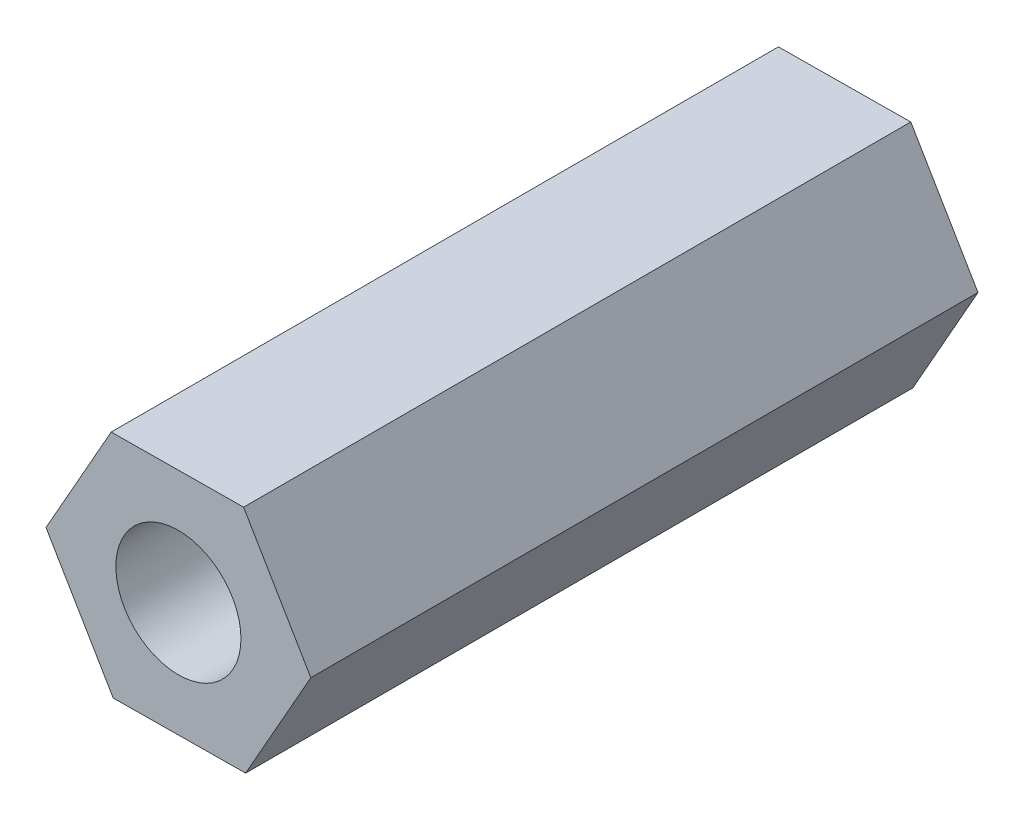
ISO-10303-21;
HEADER;
FILE_DESCRIPTION(('STEP AP214'),'2;1');
FILE_NAME('part.step','',(''),(''),'','','');
FILE_SCHEMA(('AUTOMOTIVE_DESIGN { 1 0 10303 214 1 1 1 1 }'));
ENDSEC;
DATA;
#1=APPLICATION_CONTEXT('core data for automotive mechanical design processes');
#2=APPLICATION_PROTOCOL_DEFINITION('international standard','automotive_design',2000,#1);
#3=PRODUCT_CONTEXT('',#1,'mechanical');
#4=PRODUCT('Part','Part','',(#3));
#5=PRODUCT_RELATED_PRODUCT_CATEGORY('part','',(#4));
#6=PRODUCT_DEFINITION_FORMATION('','',#4);
#7=PRODUCT_DEFINITION_CONTEXT('part definition',#1,'design');
#8=PRODUCT_DEFINITION('design','',#6,#7);
#9=PRODUCT_DEFINITION_SHAPE('','',#8);
#10=(LENGTH_UNIT() NAMED_UNIT(*) SI_UNIT(.MILLI.,.METRE.));
#11=(NAMED_UNIT(*) PLANE_ANGLE_UNIT() SI_UNIT($,.RADIAN.));
#12=(NAMED_UNIT(*) SI_UNIT($,.STERADIAN.) SOLID_ANGLE_UNIT());
#13=UNCERTAINTY_MEASURE_WITH_UNIT(LENGTH_MEASURE(1.E-05),#10,'distance_accuracy_value','');
#14=(GEOMETRIC_REPRESENTATION_CONTEXT(3) GLOBAL_UNCERTAINTY_ASSIGNED_CONTEXT((#13)) GLOBAL_UNIT_ASSIGNED_CONTEXT((#10,
#11,#12)) REPRESENTATION_CONTEXT('',''));
#15=CARTESIAN_POINT('',(0.,0.,0.));
#16=DIRECTION('',(0.,0.,1.));
#17=DIRECTION('',(1.,0.,0.));
#18=AXIS2_PLACEMENT_3D('',#15,#16,#17);
#19=CARTESIAN_POINT('',(0.,0.,16.));
#20=DIRECTION('',(0.,0.,1.));
#21=DIRECTION('',(1.,0.,0.));
#22=AXIS2_PLACEMENT_3D('',#19,#20,#21);
#23=PLANE('',#22);
#24=DIRECTION('',(0.999961257640527,0.00880245522430783,0.));
#25=VECTOR('',#24,1.);
#26=CARTESIAN_POINT('',(-1.56344497664753,-2.76386923321798,16.));
#27=LINE('',#26,#25);
#28=CARTESIAN_POINT('',(-1.56344497664753,-2.76386923321798,16.));
#29=VERTEX_POINT('',#28);
#30=CARTESIAN_POINT('',(1.61185848038122,-2.73591768380492,16.));
#31=VERTEX_POINT('',#30);
#32=EDGE_CURVE('E132',#29,#31,#27,.T.);
#33=ORIENTED_EDGE('',*,*,#32,.T.);
#34=DIRECTION('',(0.492357478980338,0.870393079529086,0.));
#35=VECTOR('',#34,1.);
#36=CARTESIAN_POINT('',(1.61185848038122,-2.73591768380492,16.));
#37=LINE('',#36,#35);
#38=CARTESIAN_POINT('',(3.17530345702875,0.0279515494130611,16.));
#39=VERTEX_POINT('',#38);
#40=EDGE_CURVE('E90',#31,#39,#37,.T.);
#41=ORIENTED_EDGE('',*,*,#40,.T.);
#42=DIRECTION('',(-0.507603778660189,0.861590624304778,0.));
#43=VECTOR('',#42,1.);
#44=CARTESIAN_POINT('',(3.17530345702875,0.0279515494130611,16.));
#45=LINE('',#44,#43);
#46=CARTESIAN_POINT('',(1.56344497664753,2.76386923321798,16.));
#47=VERTEX_POINT('',#46);
#48=EDGE_CURVE('E103',#39,#47,#45,.T.);
#49=ORIENTED_EDGE('',*,*,#48,.T.);
#50=DIRECTION('',(-0.999961257640527,-0.00880245522430783,0.));
#51=VECTOR('',#50,1.);
#52=CARTESIAN_POINT('',(1.56344497664753,2.76386923321798,16.));
#53=LINE('',#52,#51);
#54=CARTESIAN_POINT('',(-1.61185848038122,2.73591768380492,16.));
#55=VERTEX_POINT('',#54);
#56=EDGE_CURVE('E97',#47,#55,#53,.T.);
#57=ORIENTED_EDGE('',*,*,#56,.T.);
#58=DIRECTION('',(-0.492357478980338,-0.870393079529086,0.));
#59=VECTOR('',#58,1.);
#60=CARTESIAN_POINT('',(-1.61185848038122,2.73591768380492,16.));
#61=LINE('',#60,#59);
#62=CARTESIAN_POINT('',(-3.17530345702875,-0.02795154941306,16.));
#63=VERTEX_POINT('',#62);
#64=EDGE_CURVE('E101',#55,#63,#61,.T.);
#65=ORIENTED_EDGE('',*,*,#64,.T.);
#66=DIRECTION('',(0.507603778660189,-0.861590624304779,0.));
#67=VECTOR('',#66,1.);
#68=CARTESIAN_POINT('',(-3.17530345702875,-0.02795154941306,16.));
#69=LINE('',#68,#67);
#70=EDGE_CURVE('E53',#63,#29,#69,.T.);
#71=ORIENTED_EDGE('',*,*,#70,.T.);
#72=EDGE_LOOP('',(#33,#41,#49,#57,#65,#71));
#73=FACE_BOUND('',#72,.T.);
#74=CARTESIAN_POINT('',(0.,0.,16.));
#75=DIRECTION('',(0.,0.,1.));
#76=DIRECTION('',(1.,0.,0.));
#77=AXIS2_PLACEMENT_3D('',#74,#75,#76);
#78=CIRCLE('',#77,1.5);
#79=CARTESIAN_POINT('',(1.5,0.,16.));
#80=VERTEX_POINT('',#79);
#81=EDGE_CURVE('E125',#80,#80,#78,.T.);
#82=ORIENTED_EDGE('',*,*,#81,.F.);
#83=EDGE_LOOP('',(#82));
#84=FACE_BOUND('',#83,.T.);
#85=ADVANCED_FACE('F36',(#73,#84),#23,.T.);
#86=CARTESIAN_POINT('',(0.,0.,0.));
#87=DIRECTION('',(0.,0.,1.));
#88=DIRECTION('',(1.,0.,0.));
#89=AXIS2_PLACEMENT_3D('',#86,#87,#88);
#90=PLANE('',#89);
#91=DIRECTION('',(0.999961257640527,0.00880245522430783,0.));
#92=VECTOR('',#91,1.);
#93=CARTESIAN_POINT('',(-1.56344497664753,-2.76386923321798,0.));
#94=LINE('',#93,#92);
#95=CARTESIAN_POINT('',(-1.56344497664753,-2.76386923321798,0.));
#96=VERTEX_POINT('',#95);
#97=CARTESIAN_POINT('',(1.61185848038122,-2.73591768380492,0.));
#98=VERTEX_POINT('',#97);
#99=EDGE_CURVE('E121',#96,#98,#94,.T.);
#100=ORIENTED_EDGE('',*,*,#99,.F.);
#101=DIRECTION('',(0.507603778660189,-0.861590624304779,0.));
#102=VECTOR('',#101,1.);
#103=CARTESIAN_POINT('',(-3.17530345702875,-0.02795154941306,0.));
#104=LINE('',#103,#102);
#105=CARTESIAN_POINT('',(-3.17530345702875,-0.02795154941306,0.));
#106=VERTEX_POINT('',#105);
#107=EDGE_CURVE('E82',#106,#96,#104,.T.);
#108=ORIENTED_EDGE('',*,*,#107,.F.);
#109=DIRECTION('',(-0.492357478980338,-0.870393079529086,0.));
#110=VECTOR('',#109,1.);
#111=CARTESIAN_POINT('',(-1.61185848038122,2.73591768380492,0.));
#112=LINE('',#111,#110);
#113=CARTESIAN_POINT('',(-1.61185848038122,2.73591768380492,0.));
#114=VERTEX_POINT('',#113);
#115=EDGE_CURVE('E76',#114,#106,#112,.T.);
#116=ORIENTED_EDGE('',*,*,#115,.F.);
#117=DIRECTION('',(-0.999961257640527,-0.00880245522430783,0.));
#118=VECTOR('',#117,1.);
#119=CARTESIAN_POINT('',(1.56344497664753,2.76386923321798,0.));
#120=LINE('',#119,#118);
#121=CARTESIAN_POINT('',(1.56344497664753,2.76386923321798,0.));
#122=VERTEX_POINT('',#121);
#123=EDGE_CURVE('E111',#122,#114,#120,.T.);
#124=ORIENTED_EDGE('',*,*,#123,.F.);
#125=DIRECTION('',(-0.507603778660189,0.861590624304778,0.));
#126=VECTOR('',#125,1.);
#127=CARTESIAN_POINT('',(3.17530345702875,0.0279515494130611,0.));
#128=LINE('',#127,#126);
#129=CARTESIAN_POINT('',(3.17530345702875,0.0279515494130611,0.));
#130=VERTEX_POINT('',#129);
#131=EDGE_CURVE('E127',#130,#122,#128,.T.);
#132=ORIENTED_EDGE('',*,*,#131,.F.);
#133=DIRECTION('',(0.492357478980338,0.870393079529086,0.));
#134=VECTOR('',#133,1.);
#135=CARTESIAN_POINT('',(1.61185848038122,-2.73591768380492,0.));
#136=LINE('',#135,#134);
#137=EDGE_CURVE('E124',#98,#130,#136,.T.);
#138=ORIENTED_EDGE('',*,*,#137,.F.);
#139=EDGE_LOOP('',(#100,#108,#116,#124,#132,#138));
#140=FACE_BOUND('',#139,.T.);
#141=CARTESIAN_POINT('',(0.,0.,0.));
#142=DIRECTION('',(0.,0.,1.));
#143=DIRECTION('',(1.,0.,0.));
#144=AXIS2_PLACEMENT_3D('',#141,#142,#143);
#145=CIRCLE('',#144,1.5);
#146=CARTESIAN_POINT('',(1.5,0.,0.));
#147=VERTEX_POINT('',#146);
#148=EDGE_CURVE('E225',#147,#147,#145,.T.);
#149=ORIENTED_EDGE('',*,*,#148,.T.);
#150=EDGE_LOOP('',(#149));
#151=FACE_BOUND('',#150,.T.);
#152=ADVANCED_FACE('F141',(#140,#151),#90,.F.);
#153=CARTESIAN_POINT('',(-1.56344497664753,-2.76386923321798,16.));
#154=DIRECTION('',(-0.00880245522430783,0.999961257640527,0.));
#155=DIRECTION('',(-0.999961257640527,-0.00880245522430783,0.));
#156=AXIS2_PLACEMENT_3D('',#153,#154,#155);
#157=PLANE('',#156);
#158=ORIENTED_EDGE('',*,*,#99,.T.);
#159=DIRECTION('',(0.,0.,-1.));
#160=VECTOR('',#159,1.);
#161=CARTESIAN_POINT('',(1.61185848038122,-2.73591768380492,16.));
#162=LINE('',#161,#160);
#163=EDGE_CURVE('E11',#31,#98,#162,.T.);
#164=ORIENTED_EDGE('',*,*,#163,.F.);
#165=ORIENTED_EDGE('',*,*,#32,.F.);
#166=DIRECTION('',(0.,0.,-1.));
#167=VECTOR('',#166,1.);
#168=CARTESIAN_POINT('',(-1.56344497664753,-2.76386923321798,16.));
#169=LINE('',#168,#167);
#170=EDGE_CURVE('E117',#29,#96,#169,.T.);
#171=ORIENTED_EDGE('',*,*,#170,.T.);
#172=EDGE_LOOP('',(#158,#164,#165,#171));
#173=FACE_BOUND('',#172,.T.);
#174=ADVANCED_FACE('F38',(#173),#157,.F.);
#175=CARTESIAN_POINT('',(1.61185848038122,-2.73591768380492,16.));
#176=DIRECTION('',(-0.870393079529086,0.492357478980338,0.));
#177=DIRECTION('',(-0.492357478980338,-0.870393079529086,0.));
#178=AXIS2_PLACEMENT_3D('',#175,#176,#177);
#179=PLANE('',#178);
#180=ORIENTED_EDGE('',*,*,#137,.T.);
#181=DIRECTION('',(0.,0.,-1.));
#182=VECTOR('',#181,1.);
#183=CARTESIAN_POINT('',(3.17530345702875,0.0279515494130611,16.));
#184=LINE('',#183,#182);
#185=EDGE_CURVE('E45',#39,#130,#184,.T.);
#186=ORIENTED_EDGE('',*,*,#185,.F.);
#187=ORIENTED_EDGE('',*,*,#40,.F.);
#188=ORIENTED_EDGE('',*,*,#163,.T.);
#189=EDGE_LOOP('',(#180,#186,#187,#188));
#190=FACE_BOUND('',#189,.T.);
#191=ADVANCED_FACE('F166',(#190),#179,.F.);
#192=CARTESIAN_POINT('',(3.17530345702875,0.0279515494130611,16.));
#193=DIRECTION('',(-0.861590624304779,-0.507603778660189,0.));
#194=DIRECTION('',(0.507603778660189,-0.861590624304779,0.));
#195=AXIS2_PLACEMENT_3D('',#192,#193,#194);
#196=PLANE('',#195);
#197=ORIENTED_EDGE('',*,*,#131,.T.);
#198=DIRECTION('',(0.,0.,-1.));
#199=VECTOR('',#198,1.);
#200=CARTESIAN_POINT('',(1.56344497664753,2.76386923321798,16.));
#201=LINE('',#200,#199);
#202=EDGE_CURVE('E112',#47,#122,#201,.T.);
#203=ORIENTED_EDGE('',*,*,#202,.F.);
#204=ORIENTED_EDGE('',*,*,#48,.F.);
#205=ORIENTED_EDGE('',*,*,#185,.T.);
#206=EDGE_LOOP('',(#197,#203,#204,#205));
#207=FACE_BOUND('',#206,.T.);
#208=ADVANCED_FACE('F138',(#207),#196,.F.);
#209=CARTESIAN_POINT('',(1.56344497664753,2.76386923321798,16.));
#210=DIRECTION('',(0.00880245522430783,-0.999961257640527,0.));
#211=DIRECTION('',(0.999961257640527,0.00880245522430783,0.));
#212=AXIS2_PLACEMENT_3D('',#209,#210,#211);
#213=PLANE('',#212);
#214=ORIENTED_EDGE('',*,*,#123,.T.);
#215=DIRECTION('',(0.,0.,-1.));
#216=VECTOR('',#215,1.);
#217=CARTESIAN_POINT('',(-1.61185848038122,2.73591768380492,16.));
#218=LINE('',#217,#216);
#219=EDGE_CURVE('E108',#55,#114,#218,.T.);
#220=ORIENTED_EDGE('',*,*,#219,.F.);
#221=ORIENTED_EDGE('',*,*,#56,.F.);
#222=ORIENTED_EDGE('',*,*,#202,.T.);
#223=EDGE_LOOP('',(#214,#220,#221,#222));
#224=FACE_BOUND('',#223,.T.);
#225=ADVANCED_FACE('F109',(#224),#213,.F.);
#226=CARTESIAN_POINT('',(-1.61185848038122,2.73591768380492,16.));
#227=DIRECTION('',(0.870393079529086,-0.492357478980338,0.));
#228=DIRECTION('',(0.492357478980338,0.870393079529086,0.));
#229=AXIS2_PLACEMENT_3D('',#226,#227,#228);
#230=PLANE('',#229);
#231=ORIENTED_EDGE('',*,*,#115,.T.);
#232=DIRECTION('',(0.,0.,-1.));
#233=VECTOR('',#232,1.);
#234=CARTESIAN_POINT('',(-3.17530345702875,-0.02795154941306,16.));
#235=LINE('',#234,#233);
#236=EDGE_CURVE('E113',#63,#106,#235,.T.);
#237=ORIENTED_EDGE('',*,*,#236,.F.);
#238=ORIENTED_EDGE('',*,*,#64,.F.);
#239=ORIENTED_EDGE('',*,*,#219,.T.);
#240=EDGE_LOOP('',(#231,#237,#238,#239));
#241=FACE_BOUND('',#240,.T.);
#242=ADVANCED_FACE('F115',(#241),#230,.F.);
#243=CARTESIAN_POINT('',(-3.17530345702875,-0.02795154941306,16.));
#244=DIRECTION('',(0.861590624304779,0.507603778660189,0.));
#245=DIRECTION('',(-0.507603778660189,0.861590624304779,0.));
#246=AXIS2_PLACEMENT_3D('',#243,#244,#245);
#247=PLANE('',#246);
#248=ORIENTED_EDGE('',*,*,#107,.T.);
#249=ORIENTED_EDGE('',*,*,#170,.F.);
#250=ORIENTED_EDGE('',*,*,#70,.F.);
#251=ORIENTED_EDGE('',*,*,#236,.T.);
#252=EDGE_LOOP('',(#248,#249,#250,#251));
#253=FACE_BOUND('',#252,.T.);
#254=ADVANCED_FACE('F146',(#253),#247,.F.);
#255=CARTESIAN_POINT('',(0.,0.,16.));
#256=DIRECTION('',(0.,0.,-1.));
#257=DIRECTION('',(-1.,0.,0.));
#258=AXIS2_PLACEMENT_3D('',#255,#256,#257);
#259=CYLINDRICAL_SURFACE('',#258,1.5);
#260=ORIENTED_EDGE('',*,*,#81,.T.);
#261=EDGE_LOOP('',(#260));
#262=FACE_BOUND('',#261,.T.);
#263=ORIENTED_EDGE('',*,*,#148,.F.);
#264=EDGE_LOOP('',(#263));
#265=FACE_BOUND('',#264,.T.);
#266=ADVANCED_FACE('F148',(#262,#265),#259,.F.);
#267=CLOSED_SHELL('',(#85,#152,#174,#191,#208,#225,#242,#254,#266));
#268=MANIFOLD_SOLID_BREP('B2',#267);
#269=ADVANCED_BREP_SHAPE_REPRESENTATION('',(#18,#268),#14);
#270=SHAPE_DEFINITION_REPRESENTATION(#9,#269);
ENDSEC;
END-ISO-10303-21;
